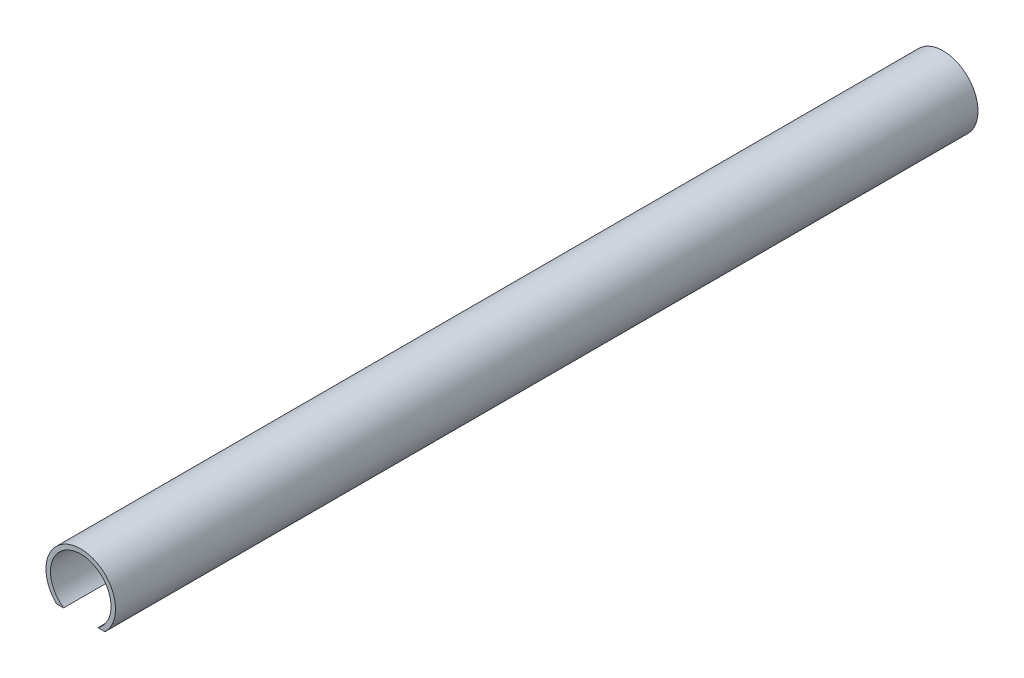
ISO-10303-21;
HEADER;
FILE_DESCRIPTION(('STEP AP214'),'2;1');
FILE_NAME('part.step','',(''),(''),'','','');
FILE_SCHEMA(('AUTOMOTIVE_DESIGN { 1 0 10303 214 1 1 1 1 }'));
ENDSEC;
DATA;
#1=APPLICATION_CONTEXT('core data for automotive mechanical design processes');
#2=APPLICATION_PROTOCOL_DEFINITION('international standard','automotive_design',2000,#1);
#3=PRODUCT_CONTEXT('',#1,'mechanical');
#4=PRODUCT('Part','Part','',(#3));
#5=PRODUCT_RELATED_PRODUCT_CATEGORY('part','',(#4));
#6=PRODUCT_DEFINITION_FORMATION('','',#4);
#7=PRODUCT_DEFINITION_CONTEXT('part definition',#1,'design');
#8=PRODUCT_DEFINITION('design','',#6,#7);
#9=PRODUCT_DEFINITION_SHAPE('','',#8);
#10=(LENGTH_UNIT() NAMED_UNIT(*) SI_UNIT(.MILLI.,.METRE.));
#11=(NAMED_UNIT(*) PLANE_ANGLE_UNIT() SI_UNIT($,.RADIAN.));
#12=(NAMED_UNIT(*) SI_UNIT($,.STERADIAN.) SOLID_ANGLE_UNIT());
#13=UNCERTAINTY_MEASURE_WITH_UNIT(LENGTH_MEASURE(1.E-05),#10,'distance_accuracy_value','');
#14=(GEOMETRIC_REPRESENTATION_CONTEXT(3) GLOBAL_UNCERTAINTY_ASSIGNED_CONTEXT((#13)) GLOBAL_UNIT_ASSIGNED_CONTEXT((#10,
#11,#12)) REPRESENTATION_CONTEXT('',''));
#15=CARTESIAN_POINT('',(0.,0.,0.));
#16=DIRECTION('',(0.,0.,1.));
#17=DIRECTION('',(1.,0.,0.));
#18=AXIS2_PLACEMENT_3D('',#15,#16,#17);
#19=CARTESIAN_POINT('',(0.,0.,833.215583248053));
#20=DIRECTION('',(0.,0.,-1.));
#21=DIRECTION('',(-1.,0.,0.));
#22=AXIS2_PLACEMENT_3D('',#19,#20,#21);
#23=CYLINDRICAL_SURFACE('',#22,30.1625);
#24=CARTESIAN_POINT('',(0.,0.,521.878150097902));
#25=DIRECTION('',(0.,0.,-1.));
#26=DIRECTION('',(-1.,0.,0.));
#27=AXIS2_PLACEMENT_3D('',#24,#25,#26);
#28=CIRCLE('',#27,30.1625);
#29=CARTESIAN_POINT('',(21.0029075140828,-21.6484244739631,521.878150097902));
#30=VERTEX_POINT('',#29);
#31=CARTESIAN_POINT('',(-21.0029075140828,-21.6484244739631,521.878150097902));
#32=VERTEX_POINT('',#31);
#33=EDGE_CURVE('E135',#30,#32,#28,.T.);
#34=ORIENTED_EDGE('',*,*,#33,.F.);
#35=DIRECTION('',(0.,0.,-1.));
#36=VECTOR('',#35,1.);
#37=CARTESIAN_POINT('',(21.0029075140828,-21.6484244739631,833.215583248053));
#38=LINE('',#37,#36);
#39=CARTESIAN_POINT('',(21.0029075140828,-21.6484244739631,464.7281500979));
#40=VERTEX_POINT('',#39);
#41=EDGE_CURVE('E179',#40,#30,#38,.F.);
#42=ORIENTED_EDGE('',*,*,#41,.F.);
#43=CARTESIAN_POINT('',(0.,0.,464.7281500979));
#44=DIRECTION('',(0.,0.,-1.));
#45=DIRECTION('',(-1.,0.,0.));
#46=AXIS2_PLACEMENT_3D('',#43,#44,#45);
#47=CIRCLE('',#46,30.1625);
#48=CARTESIAN_POINT('',(-21.0029075140828,-21.6484244739631,464.7281500979));
#49=VERTEX_POINT('',#48);
#50=EDGE_CURVE('E119',#40,#49,#47,.T.);
#51=ORIENTED_EDGE('',*,*,#50,.T.);
#52=DIRECTION('',(0.,0.,-1.));
#53=VECTOR('',#52,1.);
#54=CARTESIAN_POINT('',(-21.0029075140828,-21.6484244739631,833.215583248053));
#55=LINE('',#54,#53);
#56=EDGE_CURVE('E141',#32,#49,#55,.T.);
#57=ORIENTED_EDGE('',*,*,#56,.F.);
#58=EDGE_LOOP('',(#34,#42,#51,#57));
#59=FACE_BOUND('',#58,.T.);
#60=CARTESIAN_POINT('',(0.,0.,0.));
#61=DIRECTION('',(0.,0.,1.));
#62=DIRECTION('',(1.,0.,0.));
#63=AXIS2_PLACEMENT_3D('',#60,#61,#62);
#64=CIRCLE('',#63,30.1625);
#65=CARTESIAN_POINT('',(30.1625,0.,0.));
#66=VERTEX_POINT('',#65);
#67=EDGE_CURVE('E148',#66,#66,#64,.T.);
#68=ORIENTED_EDGE('',*,*,#67,.T.);
#69=EDGE_LOOP('',(#68));
#70=FACE_BOUND('',#69,.T.);
#71=DIRECTION('',(0.,0.,-1.));
#72=VECTOR('',#71,1.);
#73=CARTESIAN_POINT('',(-21.0029075140858,-21.6484244739602,833.215583248053));
#74=LINE('',#73,#72);
#75=CARTESIAN_POINT('',(-21.0029075140858,-21.6484244739602,747.903150097896));
#76=VERTEX_POINT('',#75);
#77=CARTESIAN_POINT('',(-21.0029075140858,-21.6484244739602,687.578150097897));
#78=VERTEX_POINT('',#77);
#79=EDGE_CURVE('E107',#76,#78,#74,.T.);
#80=ORIENTED_EDGE('',*,*,#79,.F.);
#81=CARTESIAN_POINT('',(0.,0.,747.903150097895));
#82=DIRECTION('',(0.,0.,1.));
#83=DIRECTION('',(0.,-1.,0.));
#84=AXIS2_PLACEMENT_3D('',#81,#82,#83);
#85=CIRCLE('',#84,30.1625);
#86=CARTESIAN_POINT('',(21.0029075140858,-21.6484244739602,747.903150097896));
#87=VERTEX_POINT('',#86);
#88=EDGE_CURVE('E145',#87,#76,#85,.T.);
#89=ORIENTED_EDGE('',*,*,#88,.F.);
#90=DIRECTION('',(0.,0.,-1.));
#91=VECTOR('',#90,1.);
#92=CARTESIAN_POINT('',(21.0029075140858,-21.6484244739602,833.215583248053));
#93=LINE('',#92,#91);
#94=CARTESIAN_POINT('',(21.0029075140858,-21.6484244739602,687.578150097897));
#95=VERTEX_POINT('',#94);
#96=EDGE_CURVE('E132',#95,#87,#93,.F.);
#97=ORIENTED_EDGE('',*,*,#96,.F.);
#98=CARTESIAN_POINT('',(0.,0.,687.578150097897));
#99=DIRECTION('',(0.,0.,1.));
#100=DIRECTION('',(1.,0.,0.));
#101=AXIS2_PLACEMENT_3D('',#98,#99,#100);
#102=CIRCLE('',#101,30.1625);
#103=EDGE_CURVE('E125',#78,#95,#102,.T.);
#104=ORIENTED_EDGE('',*,*,#103,.F.);
#105=EDGE_LOOP('',(#80,#89,#97,#104));
#106=FACE_BOUND('',#105,.T.);
#107=ADVANCED_FACE('F39',(#59,#70,#106),#23,.T.);
#108=CARTESIAN_POINT('',(0.,0.,833.215583248053));
#109=DIRECTION('',(0.,0.,-1.));
#110=DIRECTION('',(-1.,0.,0.));
#111=AXIS2_PLACEMENT_3D('',#108,#109,#110);
#112=CYLINDRICAL_SURFACE('',#111,26.2509);
#113=CARTESIAN_POINT('',(0.,0.,0.));
#114=DIRECTION('',(0.,0.,1.));
#115=DIRECTION('',(1.,0.,0.));
#116=AXIS2_PLACEMENT_3D('',#113,#114,#115);
#117=CIRCLE('',#116,26.2509);
#118=CARTESIAN_POINT('',(26.2509,0.,0.));
#119=VERTEX_POINT('',#118);
#120=EDGE_CURVE('E139',#119,#119,#117,.T.);
#121=ORIENTED_EDGE('',*,*,#120,.F.);
#122=EDGE_LOOP('',(#121));
#123=FACE_BOUND('',#122,.T.);
#124=DIRECTION('',(0.,0.,-1.));
#125=VECTOR('',#124,1.);
#126=CARTESIAN_POINT('',(14.8477428791421,-21.6484244739631,833.215583248053));
#127=LINE('',#126,#125);
#128=CARTESIAN_POINT('',(14.8477428791421,-21.6484244739631,464.7281500979));
#129=VERTEX_POINT('',#128);
#130=CARTESIAN_POINT('',(14.8477428791421,-21.6484244739631,521.878150097902));
#131=VERTEX_POINT('',#130);
#132=EDGE_CURVE('E157',#129,#131,#127,.F.);
#133=ORIENTED_EDGE('',*,*,#132,.T.);
#134=CARTESIAN_POINT('',(0.,0.,521.878150097902));
#135=DIRECTION('',(0.,0.,-1.));
#136=DIRECTION('',(-1.,0.,0.));
#137=AXIS2_PLACEMENT_3D('',#134,#135,#136);
#138=CIRCLE('',#137,26.2509);
#139=CARTESIAN_POINT('',(-14.8477428791421,-21.6484244739631,521.878150097902));
#140=VERTEX_POINT('',#139);
#141=EDGE_CURVE('E47',#131,#140,#138,.T.);
#142=ORIENTED_EDGE('',*,*,#141,.T.);
#143=DIRECTION('',(0.,0.,-1.));
#144=VECTOR('',#143,1.);
#145=CARTESIAN_POINT('',(-14.8477428791421,-21.6484244739631,833.215583248053));
#146=LINE('',#145,#144);
#147=CARTESIAN_POINT('',(-14.8477428791421,-21.6484244739631,464.7281500979));
#148=VERTEX_POINT('',#147);
#149=EDGE_CURVE('E160',#140,#148,#146,.T.);
#150=ORIENTED_EDGE('',*,*,#149,.T.);
#151=CARTESIAN_POINT('',(0.,0.,464.7281500979));
#152=DIRECTION('',(0.,0.,-1.));
#153=DIRECTION('',(-1.,0.,0.));
#154=AXIS2_PLACEMENT_3D('',#151,#152,#153);
#155=CIRCLE('',#154,26.2509);
#156=EDGE_CURVE('E155',#129,#148,#155,.T.);
#157=ORIENTED_EDGE('',*,*,#156,.F.);
#158=EDGE_LOOP('',(#133,#142,#150,#157));
#159=FACE_BOUND('',#158,.T.);
#160=CARTESIAN_POINT('',(0.,0.,747.903150097895));
#161=DIRECTION('',(0.,0.,1.));
#162=DIRECTION('',(0.,-1.,0.));
#163=AXIS2_PLACEMENT_3D('',#160,#161,#162);
#164=CIRCLE('',#163,26.2509);
#165=CARTESIAN_POINT('',(14.8477428791463,-21.6484244739602,747.903150097896));
#166=VERTEX_POINT('',#165);
#167=CARTESIAN_POINT('',(-14.8477428791463,-21.6484244739602,747.903150097896));
#168=VERTEX_POINT('',#167);
#169=EDGE_CURVE('E134',#166,#168,#164,.T.);
#170=ORIENTED_EDGE('',*,*,#169,.T.);
#171=DIRECTION('',(0.,0.,-1.));
#172=VECTOR('',#171,1.);
#173=CARTESIAN_POINT('',(-14.8477428791464,-21.6484244739602,833.215583248053));
#174=LINE('',#173,#172);
#175=CARTESIAN_POINT('',(-14.8477428791464,-21.6484244739602,687.578150097897));
#176=VERTEX_POINT('',#175);
#177=EDGE_CURVE('E120',#168,#176,#174,.T.);
#178=ORIENTED_EDGE('',*,*,#177,.T.);
#179=CARTESIAN_POINT('',(0.,0.,687.578150097897));
#180=DIRECTION('',(0.,0.,1.));
#181=DIRECTION('',(1.,0.,0.));
#182=AXIS2_PLACEMENT_3D('',#179,#180,#181);
#183=CIRCLE('',#182,26.2509);
#184=CARTESIAN_POINT('',(14.8477428791464,-21.6484244739602,687.578150097897));
#185=VERTEX_POINT('',#184);
#186=EDGE_CURVE('E11',#176,#185,#183,.T.);
#187=ORIENTED_EDGE('',*,*,#186,.T.);
#188=DIRECTION('',(0.,0.,-1.));
#189=VECTOR('',#188,1.);
#190=CARTESIAN_POINT('',(14.8477428791464,-21.6484244739602,833.215583248053));
#191=LINE('',#190,#189);
#192=EDGE_CURVE('E128',#185,#166,#191,.F.);
#193=ORIENTED_EDGE('',*,*,#192,.T.);
#194=EDGE_LOOP('',(#170,#178,#187,#193));
#195=FACE_BOUND('',#194,.T.);
#196=ADVANCED_FACE('F164',(#123,#159,#195),#112,.F.);
#197=CARTESIAN_POINT('',(72.0249999970021,-77.7878621136073,747.903150097897));
#198=DIRECTION('',(0.,0.,1.));
#199=DIRECTION('',(0.,1.,0.));
#200=AXIS2_PLACEMENT_3D('',#197,#198,#199);
#201=PLANE('',#200);
#202=ORIENTED_EDGE('',*,*,#88,.T.);
#203=DIRECTION('',(1.,0.,0.));
#204=VECTOR('',#203,1.);
#205=CARTESIAN_POINT('',(72.0249999970021,-21.6484244739602,747.903150097896));
#206=LINE('',#205,#204);
#207=EDGE_CURVE('E113',#76,#168,#206,.T.);
#208=ORIENTED_EDGE('',*,*,#207,.T.);
#209=ORIENTED_EDGE('',*,*,#169,.F.);
#210=EDGE_CURVE('E147',#166,#87,#206,.T.);
#211=ORIENTED_EDGE('',*,*,#210,.T.);
#212=EDGE_LOOP('',(#202,#208,#209,#211));
#213=FACE_BOUND('',#212,.T.);
#214=ADVANCED_FACE('F208',(#213),#201,.T.);
#215=CARTESIAN_POINT('',(0.,0.,0.));
#216=DIRECTION('',(0.,0.,1.));
#217=DIRECTION('',(1.,0.,0.));
#218=AXIS2_PLACEMENT_3D('',#215,#216,#217);
#219=PLANE('',#218);
#220=ORIENTED_EDGE('',*,*,#67,.F.);
#221=EDGE_LOOP('',(#220));
#222=FACE_BOUND('',#221,.T.);
#223=ORIENTED_EDGE('',*,*,#120,.T.);
#224=EDGE_LOOP('',(#223));
#225=FACE_BOUND('',#224,.T.);
#226=ADVANCED_FACE('F214',(#222,#225),#219,.F.);
#227=CARTESIAN_POINT('',(-30.1625,-21.6484244739602,687.578150097897));
#228=DIRECTION('',(0.,0.,1.));
#229=DIRECTION('',(1.,0.,0.));
#230=AXIS2_PLACEMENT_3D('',#227,#228,#229);
#231=PLANE('',#230);
#232=ORIENTED_EDGE('',*,*,#103,.T.);
#233=DIRECTION('',(1.,0.,0.));
#234=VECTOR('',#233,1.);
#235=CARTESIAN_POINT('',(-30.1625,-21.6484244739602,687.578150097897));
#236=LINE('',#235,#234);
#237=EDGE_CURVE('E129',#185,#95,#236,.T.);
#238=ORIENTED_EDGE('',*,*,#237,.F.);
#239=ORIENTED_EDGE('',*,*,#186,.F.);
#240=EDGE_CURVE('E110',#78,#176,#236,.T.);
#241=ORIENTED_EDGE('',*,*,#240,.F.);
#242=EDGE_LOOP('',(#232,#238,#239,#241));
#243=FACE_BOUND('',#242,.T.);
#244=ADVANCED_FACE('F123',(#243),#231,.T.);
#245=CARTESIAN_POINT('',(-30.1625,-21.6484244739602,732.028150097897));
#246=DIRECTION('',(0.,-1.,0.));
#247=DIRECTION('',(0.,0.,-1.));
#248=AXIS2_PLACEMENT_3D('',#245,#246,#247);
#249=PLANE('',#248);
#250=ORIENTED_EDGE('',*,*,#79,.T.);
#251=ORIENTED_EDGE('',*,*,#240,.T.);
#252=ORIENTED_EDGE('',*,*,#177,.F.);
#253=ORIENTED_EDGE('',*,*,#207,.F.);
#254=EDGE_LOOP('',(#250,#251,#252,#253));
#255=FACE_BOUND('',#254,.T.);
#256=ADVANCED_FACE('F109',(#255),#249,.T.);
#257=ORIENTED_EDGE('',*,*,#96,.T.);
#258=ORIENTED_EDGE('',*,*,#210,.F.);
#259=ORIENTED_EDGE('',*,*,#192,.F.);
#260=ORIENTED_EDGE('',*,*,#237,.T.);
#261=EDGE_LOOP('',(#257,#258,#259,#260));
#262=FACE_BOUND('',#261,.T.);
#263=ADVANCED_FACE('F228',(#262),#249,.T.);
#264=CARTESIAN_POINT('',(-30.1625,-40.6984244739619,521.878150097902));
#265=DIRECTION('',(0.,0.,-1.));
#266=DIRECTION('',(-1.,0.,0.));
#267=AXIS2_PLACEMENT_3D('',#264,#265,#266);
#268=PLANE('',#267);
#269=ORIENTED_EDGE('',*,*,#33,.T.);
#270=DIRECTION('',(1.,0.,0.));
#271=VECTOR('',#270,1.);
#272=CARTESIAN_POINT('',(-30.1625,-21.6484244739631,521.878150097902));
#273=LINE('',#272,#271);
#274=EDGE_CURVE('E175',#32,#140,#273,.T.);
#275=ORIENTED_EDGE('',*,*,#274,.T.);
#276=ORIENTED_EDGE('',*,*,#141,.F.);
#277=EDGE_CURVE('E172',#131,#30,#273,.T.);
#278=ORIENTED_EDGE('',*,*,#277,.T.);
#279=EDGE_LOOP('',(#269,#275,#276,#278));
#280=FACE_BOUND('',#279,.T.);
#281=ADVANCED_FACE('F171',(#280),#268,.T.);
#282=CARTESIAN_POINT('',(-30.1625,-21.6484244739631,521.878150097902));
#283=DIRECTION('',(0.,-1.,0.));
#284=DIRECTION('',(0.,0.,-1.));
#285=AXIS2_PLACEMENT_3D('',#282,#283,#284);
#286=PLANE('',#285);
#287=ORIENTED_EDGE('',*,*,#56,.T.);
#288=DIRECTION('',(1.,0.,0.));
#289=VECTOR('',#288,1.);
#290=CARTESIAN_POINT('',(-30.1625,-21.6484244739631,464.7281500979));
#291=LINE('',#290,#289);
#292=EDGE_CURVE('E54',#49,#148,#291,.T.);
#293=ORIENTED_EDGE('',*,*,#292,.T.);
#294=ORIENTED_EDGE('',*,*,#149,.F.);
#295=ORIENTED_EDGE('',*,*,#274,.F.);
#296=EDGE_LOOP('',(#287,#293,#294,#295));
#297=FACE_BOUND('',#296,.T.);
#298=ADVANCED_FACE('F193',(#297),#286,.T.);
#299=ORIENTED_EDGE('',*,*,#41,.T.);
#300=ORIENTED_EDGE('',*,*,#277,.F.);
#301=ORIENTED_EDGE('',*,*,#132,.F.);
#302=EDGE_CURVE('E59',#129,#40,#291,.T.);
#303=ORIENTED_EDGE('',*,*,#302,.T.);
#304=EDGE_LOOP('',(#299,#300,#301,#303));
#305=FACE_BOUND('',#304,.T.);
#306=ADVANCED_FACE('F177',(#305),#286,.T.);
#307=CARTESIAN_POINT('',(-30.1625,-40.6984244739619,464.7281500979));
#308=DIRECTION('',(0.,0.,-1.));
#309=DIRECTION('',(-1.,0.,0.));
#310=AXIS2_PLACEMENT_3D('',#307,#308,#309);
#311=PLANE('',#310);
#312=ORIENTED_EDGE('',*,*,#302,.F.);
#313=ORIENTED_EDGE('',*,*,#156,.T.);
#314=ORIENTED_EDGE('',*,*,#292,.F.);
#315=ORIENTED_EDGE('',*,*,#50,.F.);
#316=EDGE_LOOP('',(#312,#313,#314,#315));
#317=FACE_BOUND('',#316,.T.);
#318=ADVANCED_FACE('F196',(#317),#311,.F.);
#319=CLOSED_SHELL('',(#107,#196,#214,#226,#244,#256,#263,#281,#298,#306,#318));
#320=MANIFOLD_SOLID_BREP('B2',#319);
#321=ADVANCED_BREP_SHAPE_REPRESENTATION('',(#18,#320),#14);
#322=SHAPE_DEFINITION_REPRESENTATION(#9,#321);
ENDSEC;
END-ISO-10303-21;
